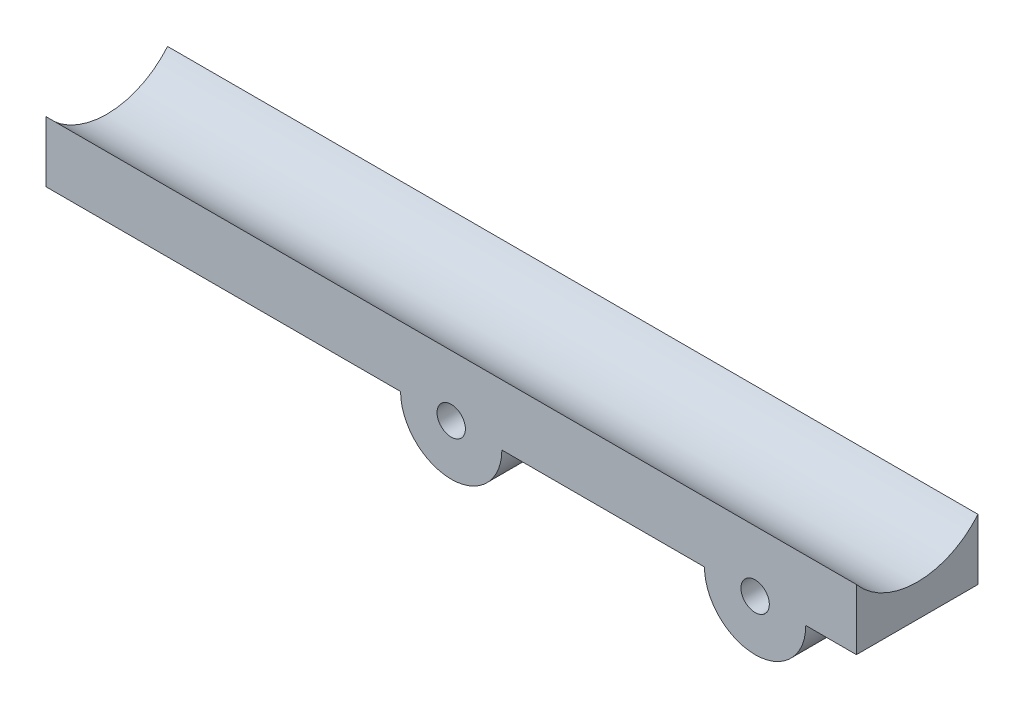
ISO-10303-21;
HEADER;
FILE_DESCRIPTION(('STEP AP214'),'2;1');
FILE_NAME('part.step','',(''),(''),'','','');
FILE_SCHEMA(('AUTOMOTIVE_DESIGN { 1 0 10303 214 1 1 1 1 }'));
ENDSEC;
DATA;
#1=APPLICATION_CONTEXT('core data for automotive mechanical design processes');
#2=APPLICATION_PROTOCOL_DEFINITION('international standard','automotive_design',2000,#1);
#3=PRODUCT_CONTEXT('',#1,'mechanical');
#4=PRODUCT('Part','Part','',(#3));
#5=PRODUCT_RELATED_PRODUCT_CATEGORY('part','',(#4));
#6=PRODUCT_DEFINITION_FORMATION('','',#4);
#7=PRODUCT_DEFINITION_CONTEXT('part definition',#1,'design');
#8=PRODUCT_DEFINITION('design','',#6,#7);
#9=PRODUCT_DEFINITION_SHAPE('','',#8);
#10=(LENGTH_UNIT() NAMED_UNIT(*) SI_UNIT(.MILLI.,.METRE.));
#11=(NAMED_UNIT(*) PLANE_ANGLE_UNIT() SI_UNIT($,.RADIAN.));
#12=(NAMED_UNIT(*) SI_UNIT($,.STERADIAN.) SOLID_ANGLE_UNIT());
#13=UNCERTAINTY_MEASURE_WITH_UNIT(LENGTH_MEASURE(1.E-05),#10,'distance_accuracy_value','');
#14=(GEOMETRIC_REPRESENTATION_CONTEXT(3) GLOBAL_UNCERTAINTY_ASSIGNED_CONTEXT((#13)) GLOBAL_UNIT_ASSIGNED_CONTEXT((#10,
#11,#12)) REPRESENTATION_CONTEXT('',''));
#15=CARTESIAN_POINT('',(0.,0.,0.));
#16=DIRECTION('',(0.,0.,1.));
#17=DIRECTION('',(1.,0.,0.));
#18=AXIS2_PLACEMENT_3D('',#15,#16,#17);
#19=CARTESIAN_POINT('',(0.,0.,0.));
#20=DIRECTION('',(0.,0.,1.));
#21=DIRECTION('',(1.,0.,0.));
#22=AXIS2_PLACEMENT_3D('',#19,#20,#21);
#23=PLANE('',#22);
#24=CARTESIAN_POINT('',(175.,0.,0.));
#25=DIRECTION('',(0.,0.,1.));
#26=DIRECTION('',(1.,0.,0.));
#27=AXIS2_PLACEMENT_3D('',#24,#25,#26);
#28=CIRCLE('',#27,8.00000000000001);
#29=CARTESIAN_POINT('',(183.,0.,0.));
#30=VERTEX_POINT('',#29);
#31=EDGE_CURVE('E223',#30,#30,#28,.T.);
#32=ORIENTED_EDGE('',*,*,#31,.T.);
#33=EDGE_LOOP('',(#32));
#34=FACE_BOUND('',#33,.T.);
#35=DIRECTION('',(1.,0.,0.));
#36=VECTOR('',#35,1.);
#37=CARTESIAN_POINT('',(0.,0.,0.));
#38=LINE('',#37,#36);
#39=CARTESIAN_POINT('',(112.5,0.,0.));
#40=VERTEX_POINT('',#39);
#41=CARTESIAN_POINT('',(162.5,0.,0.));
#42=VERTEX_POINT('',#41);
#43=EDGE_CURVE('E163',#40,#42,#38,.T.);
#44=ORIENTED_EDGE('',*,*,#43,.F.);
#45=CARTESIAN_POINT('',(100.,0.,0.));
#46=DIRECTION('',(0.,0.,1.));
#47=DIRECTION('',(1.,0.,0.));
#48=AXIS2_PLACEMENT_3D('',#45,#46,#47);
#49=CIRCLE('',#48,12.5);
#50=CARTESIAN_POINT('',(87.5,0.,0.));
#51=VERTEX_POINT('',#50);
#52=EDGE_CURVE('E108',#51,#40,#49,.T.);
#53=ORIENTED_EDGE('',*,*,#52,.F.);
#54=CARTESIAN_POINT('',(0.,0.,0.));
#55=VERTEX_POINT('',#54);
#56=EDGE_CURVE('E102',#55,#51,#38,.T.);
#57=ORIENTED_EDGE('',*,*,#56,.F.);
#58=DIRECTION('',(0.,1.,0.));
#59=VECTOR('',#58,1.);
#60=CARTESIAN_POINT('',(0.,0.,0.));
#61=LINE('',#60,#59);
#62=CARTESIAN_POINT('',(0.,15.,0.));
#63=VERTEX_POINT('',#62);
#64=EDGE_CURVE('E137',#55,#63,#61,.T.);
#65=ORIENTED_EDGE('',*,*,#64,.T.);
#66=DIRECTION('',(1.,0.,0.));
#67=VECTOR('',#66,1.);
#68=CARTESIAN_POINT('',(0.,15.,0.));
#69=LINE('',#68,#67);
#70=CARTESIAN_POINT('',(200.,15.,0.));
#71=VERTEX_POINT('',#70);
#72=EDGE_CURVE('E176',#63,#71,#69,.T.);
#73=ORIENTED_EDGE('',*,*,#72,.T.);
#74=DIRECTION('',(0.,1.,0.));
#75=VECTOR('',#74,1.);
#76=CARTESIAN_POINT('',(200.,-3.70074341541719E-13,0.));
#77=LINE('',#76,#75);
#78=CARTESIAN_POINT('',(200.,0.,0.));
#79=VERTEX_POINT('',#78);
#80=EDGE_CURVE('E172',#79,#71,#77,.T.);
#81=ORIENTED_EDGE('',*,*,#80,.F.);
#82=CARTESIAN_POINT('',(187.5,0.,0.));
#83=VERTEX_POINT('',#82);
#84=EDGE_CURVE('E169',#83,#79,#38,.T.);
#85=ORIENTED_EDGE('',*,*,#84,.F.);
#86=CARTESIAN_POINT('',(175.,0.,0.));
#87=DIRECTION('',(0.,0.,1.));
#88=DIRECTION('',(1.,0.,0.));
#89=AXIS2_PLACEMENT_3D('',#86,#87,#88);
#90=CIRCLE('',#89,12.5);
#91=EDGE_CURVE('E167',#42,#83,#90,.T.);
#92=ORIENTED_EDGE('',*,*,#91,.F.);
#93=EDGE_LOOP('',(#44,#53,#57,#65,#73,#81,#85,#92));
#94=FACE_BOUND('',#93,.T.);
#95=CARTESIAN_POINT('',(100.,0.,0.));
#96=DIRECTION('',(0.,0.,1.));
#97=DIRECTION('',(1.,0.,0.));
#98=AXIS2_PLACEMENT_3D('',#95,#96,#97);
#99=CIRCLE('',#98,8.00000000000001);
#100=CARTESIAN_POINT('',(108.,0.,0.));
#101=VERTEX_POINT('',#100);
#102=EDGE_CURVE('E236',#101,#101,#99,.T.);
#103=ORIENTED_EDGE('',*,*,#102,.T.);
#104=EDGE_LOOP('',(#103));
#105=FACE_BOUND('',#104,.T.);
#106=ADVANCED_FACE('F61',(#34,#94,#105),#23,.F.);
#107=CARTESIAN_POINT('',(0.,0.,30.));
#108=DIRECTION('',(0.,1.,0.));
#109=DIRECTION('',(-1.,0.,0.));
#110=AXIS2_PLACEMENT_3D('',#107,#108,#109);
#111=PLANE('',#110);
#112=ORIENTED_EDGE('',*,*,#43,.T.);
#113=DIRECTION('',(0.,0.,-1.));
#114=VECTOR('',#113,1.);
#115=CARTESIAN_POINT('',(162.5,0.,30.));
#116=LINE('',#115,#114);
#117=CARTESIAN_POINT('',(162.5,0.,30.));
#118=VERTEX_POINT('',#117);
#119=EDGE_CURVE('E13',#118,#42,#116,.T.);
#120=ORIENTED_EDGE('',*,*,#119,.F.);
#121=DIRECTION('',(1.,0.,0.));
#122=VECTOR('',#121,1.);
#123=CARTESIAN_POINT('',(0.,0.,30.));
#124=LINE('',#123,#122);
#125=CARTESIAN_POINT('',(112.5,0.,30.));
#126=VERTEX_POINT('',#125);
#127=EDGE_CURVE('E147',#126,#118,#124,.T.);
#128=ORIENTED_EDGE('',*,*,#127,.F.);
#129=DIRECTION('',(0.,0.,-1.));
#130=VECTOR('',#129,1.);
#131=CARTESIAN_POINT('',(112.5,0.,30.));
#132=LINE('',#131,#130);
#133=EDGE_CURVE('E162',#126,#40,#132,.T.);
#134=ORIENTED_EDGE('',*,*,#133,.T.);
#135=EDGE_LOOP('',(#112,#120,#128,#134));
#136=FACE_BOUND('',#135,.T.);
#137=ADVANCED_FACE('F258',(#136),#111,.F.);
#138=CARTESIAN_POINT('',(175.,0.,30.));
#139=DIRECTION('',(0.,0.,-1.));
#140=DIRECTION('',(-1.,0.,0.));
#141=AXIS2_PLACEMENT_3D('',#138,#139,#140);
#142=CYLINDRICAL_SURFACE('',#141,12.5);
#143=ORIENTED_EDGE('',*,*,#91,.T.);
#144=DIRECTION('',(0.,0.,-1.));
#145=VECTOR('',#144,1.);
#146=CARTESIAN_POINT('',(187.5,0.,30.));
#147=LINE('',#146,#145);
#148=CARTESIAN_POINT('',(187.5,0.,30.));
#149=VERTEX_POINT('',#148);
#150=EDGE_CURVE('E71',#149,#83,#147,.T.);
#151=ORIENTED_EDGE('',*,*,#150,.F.);
#152=CARTESIAN_POINT('',(175.,0.,30.));
#153=DIRECTION('',(0.,0.,1.));
#154=DIRECTION('',(1.,0.,0.));
#155=AXIS2_PLACEMENT_3D('',#152,#153,#154);
#156=CIRCLE('',#155,12.5);
#157=EDGE_CURVE('E116',#118,#149,#156,.T.);
#158=ORIENTED_EDGE('',*,*,#157,.F.);
#159=ORIENTED_EDGE('',*,*,#119,.T.);
#160=EDGE_LOOP('',(#143,#151,#158,#159));
#161=FACE_BOUND('',#160,.T.);
#162=ADVANCED_FACE('F63',(#161),#142,.T.);
#163=ORIENTED_EDGE('',*,*,#84,.T.);
#164=DIRECTION('',(0.,0.,-1.));
#165=VECTOR('',#164,1.);
#166=CARTESIAN_POINT('',(200.,0.,30.));
#167=LINE('',#166,#165);
#168=CARTESIAN_POINT('',(200.,0.,30.));
#169=VERTEX_POINT('',#168);
#170=EDGE_CURVE('E139',#169,#79,#167,.T.);
#171=ORIENTED_EDGE('',*,*,#170,.F.);
#172=EDGE_CURVE('E146',#149,#169,#124,.T.);
#173=ORIENTED_EDGE('',*,*,#172,.F.);
#174=ORIENTED_EDGE('',*,*,#150,.T.);
#175=EDGE_LOOP('',(#163,#171,#173,#174));
#176=FACE_BOUND('',#175,.T.);
#177=ADVANCED_FACE('F195',(#176),#111,.F.);
#178=CARTESIAN_POINT('',(200.,-3.70074341541719E-13,30.));
#179=DIRECTION('',(-1.,0.,0.));
#180=DIRECTION('',(0.,-1.,0.));
#181=AXIS2_PLACEMENT_3D('',#178,#179,#180);
#182=PLANE('',#181);
#183=ORIENTED_EDGE('',*,*,#80,.T.);
#184=CARTESIAN_POINT('',(200.,27.5714285714286,15.));
#185=DIRECTION('',(-1.,0.,0.));
#186=DIRECTION('',(0.,-1.,0.));
#187=AXIS2_PLACEMENT_3D('',#184,#185,#186);
#188=CIRCLE('',#187,19.5714285714286);
#189=CARTESIAN_POINT('',(200.,15.,30.));
#190=VERTEX_POINT('',#189);
#191=EDGE_CURVE('E245',#190,#71,#188,.F.);
#192=ORIENTED_EDGE('',*,*,#191,.F.);
#193=DIRECTION('',(0.,1.,0.));
#194=VECTOR('',#193,1.);
#195=CARTESIAN_POINT('',(200.,-3.70074341541719E-13,30.));
#196=LINE('',#195,#194);
#197=EDGE_CURVE('E156',#169,#190,#196,.T.);
#198=ORIENTED_EDGE('',*,*,#197,.F.);
#199=ORIENTED_EDGE('',*,*,#170,.T.);
#200=EDGE_LOOP('',(#183,#192,#198,#199));
#201=FACE_BOUND('',#200,.T.);
#202=ADVANCED_FACE('F254',(#201),#182,.F.);
#203=CARTESIAN_POINT('',(0.,0.,30.));
#204=DIRECTION('',(-1.,0.,0.));
#205=DIRECTION('',(0.,0.,1.));
#206=AXIS2_PLACEMENT_3D('',#203,#204,#205);
#207=PLANE('',#206);
#208=CARTESIAN_POINT('',(0.,27.5714285714286,15.));
#209=DIRECTION('',(-1.,0.,0.));
#210=DIRECTION('',(0.,0.,1.));
#211=AXIS2_PLACEMENT_3D('',#208,#209,#210);
#212=CIRCLE('',#211,19.5714285714286);
#213=CARTESIAN_POINT('',(0.,15.,30.));
#214=VERTEX_POINT('',#213);
#215=EDGE_CURVE('E224',#63,#214,#212,.T.);
#216=ORIENTED_EDGE('',*,*,#215,.F.);
#217=ORIENTED_EDGE('',*,*,#64,.F.);
#218=DIRECTION('',(0.,0.,-1.));
#219=VECTOR('',#218,1.);
#220=CARTESIAN_POINT('',(0.,0.,30.));
#221=LINE('',#220,#219);
#222=CARTESIAN_POINT('',(0.,0.,30.));
#223=VERTEX_POINT('',#222);
#224=EDGE_CURVE('E130',#223,#55,#221,.T.);
#225=ORIENTED_EDGE('',*,*,#224,.F.);
#226=DIRECTION('',(0.,1.,0.));
#227=VECTOR('',#226,1.);
#228=CARTESIAN_POINT('',(0.,0.,30.));
#229=LINE('',#228,#227);
#230=EDGE_CURVE('E135',#223,#214,#229,.T.);
#231=ORIENTED_EDGE('',*,*,#230,.T.);
#232=EDGE_LOOP('',(#216,#217,#225,#231));
#233=FACE_BOUND('',#232,.T.);
#234=ADVANCED_FACE('F133',(#233),#207,.T.);
#235=ORIENTED_EDGE('',*,*,#56,.T.);
#236=DIRECTION('',(0.,0.,-1.));
#237=VECTOR('',#236,1.);
#238=CARTESIAN_POINT('',(87.5,0.,30.));
#239=LINE('',#238,#237);
#240=CARTESIAN_POINT('',(87.5,0.,30.));
#241=VERTEX_POINT('',#240);
#242=EDGE_CURVE('E140',#241,#51,#239,.T.);
#243=ORIENTED_EDGE('',*,*,#242,.F.);
#244=EDGE_CURVE('E142',#223,#241,#124,.T.);
#245=ORIENTED_EDGE('',*,*,#244,.F.);
#246=ORIENTED_EDGE('',*,*,#224,.T.);
#247=EDGE_LOOP('',(#235,#243,#245,#246));
#248=FACE_BOUND('',#247,.T.);
#249=ADVANCED_FACE('F143',(#248),#111,.F.);
#250=CARTESIAN_POINT('',(100.,0.,30.));
#251=DIRECTION('',(0.,0.,-1.));
#252=DIRECTION('',(-1.,0.,0.));
#253=AXIS2_PLACEMENT_3D('',#250,#251,#252);
#254=CYLINDRICAL_SURFACE('',#253,12.5);
#255=ORIENTED_EDGE('',*,*,#52,.T.);
#256=ORIENTED_EDGE('',*,*,#133,.F.);
#257=CARTESIAN_POINT('',(100.,0.,30.));
#258=DIRECTION('',(0.,0.,1.));
#259=DIRECTION('',(1.,0.,0.));
#260=AXIS2_PLACEMENT_3D('',#257,#258,#259);
#261=CIRCLE('',#260,12.5);
#262=EDGE_CURVE('E79',#241,#126,#261,.T.);
#263=ORIENTED_EDGE('',*,*,#262,.F.);
#264=ORIENTED_EDGE('',*,*,#242,.T.);
#265=EDGE_LOOP('',(#255,#256,#263,#264));
#266=FACE_BOUND('',#265,.T.);
#267=ADVANCED_FACE('F260',(#266),#254,.T.);
#268=CARTESIAN_POINT('',(0.,0.,30.));
#269=DIRECTION('',(0.,0.,1.));
#270=DIRECTION('',(1.,0.,0.));
#271=AXIS2_PLACEMENT_3D('',#268,#269,#270);
#272=PLANE('',#271);
#273=CARTESIAN_POINT('',(100.,0.,30.));
#274=DIRECTION('',(0.,0.,1.));
#275=DIRECTION('',(1.,0.,0.));
#276=AXIS2_PLACEMENT_3D('',#273,#274,#275);
#277=CIRCLE('',#276,3.50000000000001);
#278=CARTESIAN_POINT('',(103.5,0.,30.));
#279=VERTEX_POINT('',#278);
#280=EDGE_CURVE('E168',#279,#279,#277,.T.);
#281=ORIENTED_EDGE('',*,*,#280,.F.);
#282=EDGE_LOOP('',(#281));
#283=FACE_BOUND('',#282,.T.);
#284=CARTESIAN_POINT('',(175.,0.,30.));
#285=DIRECTION('',(0.,0.,1.));
#286=DIRECTION('',(1.,0.,0.));
#287=AXIS2_PLACEMENT_3D('',#284,#285,#286);
#288=CIRCLE('',#287,3.49999999999999);
#289=CARTESIAN_POINT('',(178.5,0.,30.));
#290=VERTEX_POINT('',#289);
#291=EDGE_CURVE('E211',#290,#290,#288,.T.);
#292=ORIENTED_EDGE('',*,*,#291,.F.);
#293=EDGE_LOOP('',(#292));
#294=FACE_BOUND('',#293,.T.);
#295=ORIENTED_EDGE('',*,*,#127,.T.);
#296=ORIENTED_EDGE('',*,*,#157,.T.);
#297=ORIENTED_EDGE('',*,*,#172,.T.);
#298=ORIENTED_EDGE('',*,*,#197,.T.);
#299=DIRECTION('',(1.,0.,0.));
#300=VECTOR('',#299,1.);
#301=CARTESIAN_POINT('',(0.,15.,30.));
#302=LINE('',#301,#300);
#303=EDGE_CURVE('E152',#214,#190,#302,.T.);
#304=ORIENTED_EDGE('',*,*,#303,.F.);
#305=ORIENTED_EDGE('',*,*,#230,.F.);
#306=ORIENTED_EDGE('',*,*,#244,.T.);
#307=ORIENTED_EDGE('',*,*,#262,.T.);
#308=EDGE_LOOP('',(#295,#296,#297,#298,#304,#305,#306,#307));
#309=FACE_BOUND('',#308,.T.);
#310=ADVANCED_FACE('F149',(#283,#294,#309),#272,.T.);
#311=CARTESIAN_POINT('',(175.,0.,-0.001000000000001));
#312=DIRECTION('',(0.,0.,1.));
#313=DIRECTION('',(1.,0.,0.));
#314=AXIS2_PLACEMENT_3D('',#311,#312,#313);
#315=CYLINDRICAL_SURFACE('',#314,3.49999999999999);
#316=CARTESIAN_POINT('',(175.,0.,3.));
#317=DIRECTION('',(0.,0.,1.));
#318=DIRECTION('',(1.,0.,0.));
#319=AXIS2_PLACEMENT_3D('',#316,#317,#318);
#320=CIRCLE('',#319,3.49999999999999);
#321=CARTESIAN_POINT('',(178.5,0.,3.));
#322=VERTEX_POINT('',#321);
#323=EDGE_CURVE('E219',#322,#322,#320,.T.);
#324=ORIENTED_EDGE('',*,*,#323,.F.);
#325=EDGE_LOOP('',(#324));
#326=FACE_BOUND('',#325,.T.);
#327=ORIENTED_EDGE('',*,*,#291,.T.);
#328=EDGE_LOOP('',(#327));
#329=FACE_BOUND('',#328,.T.);
#330=ADVANCED_FACE('F268',(#326,#329),#315,.F.);
#331=CARTESIAN_POINT('',(100.,0.,-0.001000000000001));
#332=DIRECTION('',(0.,0.,1.));
#333=DIRECTION('',(1.,0.,0.));
#334=AXIS2_PLACEMENT_3D('',#331,#332,#333);
#335=CYLINDRICAL_SURFACE('',#334,3.50000000000001);
#336=CARTESIAN_POINT('',(100.,0.,3.));
#337=DIRECTION('',(0.,0.,1.));
#338=DIRECTION('',(1.,0.,0.));
#339=AXIS2_PLACEMENT_3D('',#336,#337,#338);
#340=CIRCLE('',#339,3.50000000000001);
#341=CARTESIAN_POINT('',(103.5,0.,3.));
#342=VERTEX_POINT('',#341);
#343=EDGE_CURVE('E232',#342,#342,#340,.T.);
#344=ORIENTED_EDGE('',*,*,#343,.F.);
#345=EDGE_LOOP('',(#344));
#346=FACE_BOUND('',#345,.T.);
#347=ORIENTED_EDGE('',*,*,#280,.T.);
#348=EDGE_LOOP('',(#347));
#349=FACE_BOUND('',#348,.T.);
#350=ADVANCED_FACE('F282',(#346,#349),#335,.F.);
#351=CARTESIAN_POINT('',(100.,0.,52.6274169979695));
#352=DIRECTION('',(0.,0.,-1.));
#353=DIRECTION('',(-1.,0.,0.));
#354=AXIS2_PLACEMENT_3D('',#351,#352,#353);
#355=CYLINDRICAL_SURFACE('',#354,8.00000000000001);
#356=ORIENTED_EDGE('',*,*,#102,.F.);
#357=EDGE_LOOP('',(#356));
#358=FACE_BOUND('',#357,.T.);
#359=CARTESIAN_POINT('',(100.,0.,3.));
#360=DIRECTION('',(0.,0.,1.));
#361=DIRECTION('',(1.,0.,0.));
#362=AXIS2_PLACEMENT_3D('',#359,#360,#361);
#363=CIRCLE('',#362,8.00000000000001);
#364=CARTESIAN_POINT('',(108.,0.,3.));
#365=VERTEX_POINT('',#364);
#366=EDGE_CURVE('E215',#365,#365,#363,.T.);
#367=ORIENTED_EDGE('',*,*,#366,.T.);
#368=EDGE_LOOP('',(#367));
#369=FACE_BOUND('',#368,.T.);
#370=ADVANCED_FACE('F286',(#358,#369),#355,.F.);
#371=CARTESIAN_POINT('',(0.,0.,3.));
#372=DIRECTION('',(0.,0.,1.));
#373=DIRECTION('',(1.,0.,0.));
#374=AXIS2_PLACEMENT_3D('',#371,#372,#373);
#375=PLANE('',#374);
#376=ORIENTED_EDGE('',*,*,#343,.T.);
#377=EDGE_LOOP('',(#376));
#378=FACE_BOUND('',#377,.T.);
#379=ORIENTED_EDGE('',*,*,#366,.F.);
#380=EDGE_LOOP('',(#379));
#381=FACE_BOUND('',#380,.T.);
#382=ADVANCED_FACE('F292',(#378,#381),#375,.F.);
#383=CARTESIAN_POINT('',(175.,0.,52.6274169979695));
#384=DIRECTION('',(0.,0.,-1.));
#385=DIRECTION('',(-1.,0.,0.));
#386=AXIS2_PLACEMENT_3D('',#383,#384,#385);
#387=CYLINDRICAL_SURFACE('',#386,8.00000000000001);
#388=ORIENTED_EDGE('',*,*,#31,.F.);
#389=EDGE_LOOP('',(#388));
#390=FACE_BOUND('',#389,.T.);
#391=CARTESIAN_POINT('',(175.,0.,3.));
#392=DIRECTION('',(0.,0.,1.));
#393=DIRECTION('',(1.,0.,0.));
#394=AXIS2_PLACEMENT_3D('',#391,#392,#393);
#395=CIRCLE('',#394,8.00000000000001);
#396=CARTESIAN_POINT('',(183.,0.,3.));
#397=VERTEX_POINT('',#396);
#398=EDGE_CURVE('E228',#397,#397,#395,.T.);
#399=ORIENTED_EDGE('',*,*,#398,.T.);
#400=EDGE_LOOP('',(#399));
#401=FACE_BOUND('',#400,.T.);
#402=ADVANCED_FACE('F288',(#390,#401),#387,.F.);
#403=CARTESIAN_POINT('',(0.,0.,3.));
#404=DIRECTION('',(0.,0.,1.));
#405=DIRECTION('',(1.,0.,0.));
#406=AXIS2_PLACEMENT_3D('',#403,#404,#405);
#407=PLANE('',#406);
#408=ORIENTED_EDGE('',*,*,#323,.T.);
#409=EDGE_LOOP('',(#408));
#410=FACE_BOUND('',#409,.T.);
#411=ORIENTED_EDGE('',*,*,#398,.F.);
#412=EDGE_LOOP('',(#411));
#413=FACE_BOUND('',#412,.T.);
#414=ADVANCED_FACE('F291',(#410,#413),#407,.F.);
#415=CARTESIAN_POINT('',(200.001,27.5714285714286,15.));
#416=DIRECTION('',(-1.,0.,0.));
#417=DIRECTION('',(0.,0.,1.));
#418=AXIS2_PLACEMENT_3D('',#415,#416,#417);
#419=CYLINDRICAL_SURFACE('',#418,19.5714285714286);
#420=ORIENTED_EDGE('',*,*,#191,.T.);
#421=ORIENTED_EDGE('',*,*,#72,.F.);
#422=ORIENTED_EDGE('',*,*,#215,.T.);
#423=ORIENTED_EDGE('',*,*,#303,.T.);
#424=EDGE_LOOP('',(#420,#421,#422,#423));
#425=FACE_BOUND('',#424,.T.);
#426=ADVANCED_FACE('F251',(#425),#419,.F.);
#427=CLOSED_SHELL('',(#106,#137,#162,#177,#202,#234,#249,#267,#310,#330,#350,#370,#382,#402,
#414,#426));
#428=MANIFOLD_SOLID_BREP('B2',#427);
#429=ADVANCED_BREP_SHAPE_REPRESENTATION('',(#18,#428),#14);
#430=SHAPE_DEFINITION_REPRESENTATION(#9,#429);
ENDSEC;
END-ISO-10303-21;
